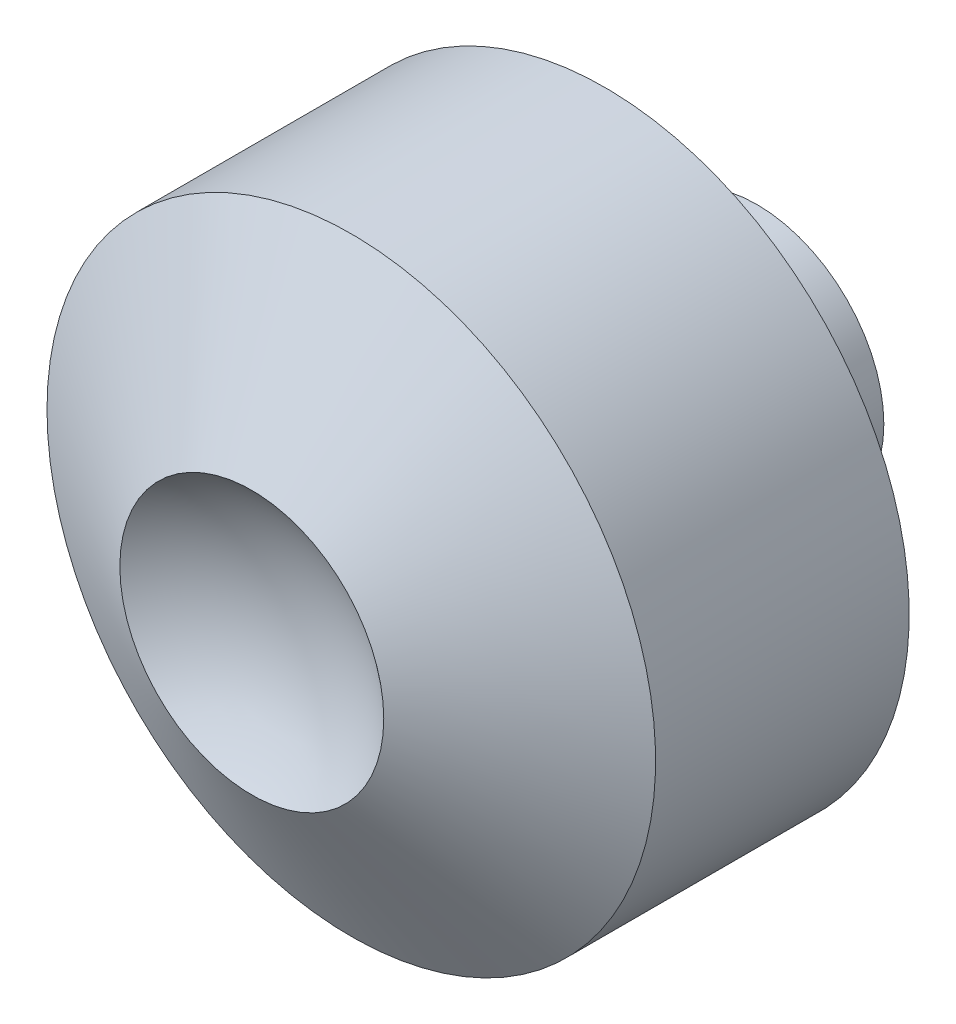
ISO-10303-21;
HEADER;
FILE_DESCRIPTION(('STEP AP214'),'2;1');
FILE_NAME('part.step','',(''),(''),'','','');
FILE_SCHEMA(('AUTOMOTIVE_DESIGN { 1 0 10303 214 1 1 1 1 }'));
ENDSEC;
DATA;
#1=APPLICATION_CONTEXT('core data for automotive mechanical design processes');
#2=APPLICATION_PROTOCOL_DEFINITION('international standard','automotive_design',2000,#1);
#3=PRODUCT_CONTEXT('',#1,'mechanical');
#4=PRODUCT('Part','Part','',(#3));
#5=PRODUCT_RELATED_PRODUCT_CATEGORY('part','',(#4));
#6=PRODUCT_DEFINITION_FORMATION('','',#4);
#7=PRODUCT_DEFINITION_CONTEXT('part definition',#1,'design');
#8=PRODUCT_DEFINITION('design','',#6,#7);
#9=PRODUCT_DEFINITION_SHAPE('','',#8);
#10=(LENGTH_UNIT() NAMED_UNIT(*) SI_UNIT(.MILLI.,.METRE.));
#11=(NAMED_UNIT(*) PLANE_ANGLE_UNIT() SI_UNIT($,.RADIAN.));
#12=(NAMED_UNIT(*) SI_UNIT($,.STERADIAN.) SOLID_ANGLE_UNIT());
#13=UNCERTAINTY_MEASURE_WITH_UNIT(LENGTH_MEASURE(1.E-05),#10,'distance_accuracy_value','');
#14=(GEOMETRIC_REPRESENTATION_CONTEXT(3) GLOBAL_UNCERTAINTY_ASSIGNED_CONTEXT((#13)) GLOBAL_UNIT_ASSIGNED_CONTEXT((#10,
#11,#12)) REPRESENTATION_CONTEXT('',''));
#15=CARTESIAN_POINT('',(0.,0.,0.));
#16=DIRECTION('',(0.,0.,1.));
#17=DIRECTION('',(1.,0.,0.));
#18=AXIS2_PLACEMENT_3D('',#15,#16,#17);
#19=CARTESIAN_POINT('',(0.,0.,5.));
#20=DIRECTION('',(0.,1.,0.));
#21=DIRECTION('',(0.,0.,-1.));
#22=AXIS2_PLACEMENT_3D('',#19,#20,#21);
#23=SPHERICAL_SURFACE('',#22,4.);
#24=CARTESIAN_POINT('',(0.,0.,5.));
#25=DIRECTION('',(0.,0.,-1.));
#26=DIRECTION('',(-1.,0.,0.));
#27=AXIS2_PLACEMENT_3D('',#24,#25,#26);
#28=SPHERICAL_SURFACE('',#27,4.);
#29=CARTESIAN_POINT('',(0.,0.,1.96189209298539));
#30=DIRECTION('',(0.,0.,-1.));
#31=DIRECTION('',(-1.,0.,0.));
#32=AXIS2_PLACEMENT_3D('',#29,#30,#31);
#33=CIRCLE('',#32,2.60190321598158);
#34=CARTESIAN_POINT('',(-2.60190321598158,0.,1.96189209298539));
#35=VERTEX_POINT('',#34);
#36=EDGE_CURVE('E50',#35,#35,#33,.F.);
#37=ORIENTED_EDGE('',*,*,#36,.T.);
#38=EDGE_LOOP('',(#37));
#39=FACE_BOUND('',#38,.T.);
#40=ADVANCED_FACE('F45',(#39),#28,.F.);
#41=CARTESIAN_POINT('',(0.,0.,2.));
#42=DIRECTION('',(0.,0.,-1.));
#43=DIRECTION('',(-1.,0.,0.));
#44=AXIS2_PLACEMENT_3D('',#41,#42,#43);
#45=CONICAL_SURFACE('',#44,2.53589838486217,1.0471975511966);
#46=CARTESIAN_POINT('',(0.,0.,0.));
#47=DIRECTION('',(0.,0.,-1.));
#48=DIRECTION('',(-1.,0.,0.));
#49=AXIS2_PLACEMENT_3D('',#46,#47,#48);
#50=CIRCLE('',#49,6.);
#51=CARTESIAN_POINT('',(-6.,0.,0.));
#52=VERTEX_POINT('',#51);
#53=EDGE_CURVE('E63',#52,#52,#50,.T.);
#54=ORIENTED_EDGE('',*,*,#53,.F.);
#55=EDGE_LOOP('',(#54));
#56=FACE_BOUND('',#55,.T.);
#57=ORIENTED_EDGE('',*,*,#36,.F.);
#58=EDGE_LOOP('',(#57));
#59=FACE_BOUND('',#58,.T.);
#60=ADVANCED_FACE('F48',(#56,#59),#45,.T.);
#61=CARTESIAN_POINT('',(0.,0.,-5.));
#62=DIRECTION('',(0.,0.,1.));
#63=DIRECTION('',(1.,0.,0.));
#64=AXIS2_PLACEMENT_3D('',#61,#62,#63);
#65=CYLINDRICAL_SURFACE('',#64,6.);
#66=CARTESIAN_POINT('',(0.,0.,-5.));
#67=DIRECTION('',(0.,0.,-1.));
#68=DIRECTION('',(-1.,0.,0.));
#69=AXIS2_PLACEMENT_3D('',#66,#67,#68);
#70=CIRCLE('',#69,6.);
#71=CARTESIAN_POINT('',(-6.,0.,-5.));
#72=VERTEX_POINT('',#71);
#73=EDGE_CURVE('E58',#72,#72,#70,.T.);
#74=ORIENTED_EDGE('',*,*,#73,.F.);
#75=EDGE_LOOP('',(#74));
#76=FACE_BOUND('',#75,.T.);
#77=ORIENTED_EDGE('',*,*,#53,.T.);
#78=EDGE_LOOP('',(#77));
#79=FACE_BOUND('',#78,.T.);
#80=ADVANCED_FACE('F81',(#76,#79),#65,.T.);
#81=CARTESIAN_POINT('',(0.,0.,-5.));
#82=DIRECTION('',(0.,0.,-1.));
#83=DIRECTION('',(-1.,0.,0.));
#84=AXIS2_PLACEMENT_3D('',#81,#82,#83);
#85=PLANE('',#84);
#86=CARTESIAN_POINT('',(0.,0.,-5.));
#87=DIRECTION('',(0.,0.,-1.));
#88=DIRECTION('',(-1.,0.,0.));
#89=AXIS2_PLACEMENT_3D('',#86,#87,#88);
#90=CIRCLE('',#89,2.5);
#91=CARTESIAN_POINT('',(-2.5,0.,-5.));
#92=VERTEX_POINT('',#91);
#93=EDGE_CURVE('E10',#92,#92,#90,.T.);
#94=ORIENTED_EDGE('',*,*,#93,.F.);
#95=EDGE_LOOP('',(#94));
#96=FACE_BOUND('',#95,.T.);
#97=ORIENTED_EDGE('',*,*,#73,.T.);
#98=EDGE_LOOP('',(#97));
#99=FACE_BOUND('',#98,.T.);
#100=ADVANCED_FACE('F74',(#96,#99),#85,.T.);
#101=CARTESIAN_POINT('',(0.,0.,-8.));
#102=DIRECTION('',(0.,0.,1.));
#103=DIRECTION('',(1.,0.,0.));
#104=AXIS2_PLACEMENT_3D('',#101,#102,#103);
#105=CYLINDRICAL_SURFACE('',#104,2.5);
#106=CARTESIAN_POINT('',(0.,0.,-8.));
#107=DIRECTION('',(0.,0.,-1.));
#108=DIRECTION('',(-1.,0.,0.));
#109=AXIS2_PLACEMENT_3D('',#106,#107,#108);
#110=CIRCLE('',#109,2.5);
#111=CARTESIAN_POINT('',(-2.5,0.,-8.));
#112=VERTEX_POINT('',#111);
#113=EDGE_CURVE('E61',#112,#112,#110,.T.);
#114=ORIENTED_EDGE('',*,*,#113,.F.);
#115=EDGE_LOOP('',(#114));
#116=FACE_BOUND('',#115,.T.);
#117=ORIENTED_EDGE('',*,*,#93,.T.);
#118=EDGE_LOOP('',(#117));
#119=FACE_BOUND('',#118,.T.);
#120=ADVANCED_FACE('F72',(#116,#119),#105,.T.);
#121=CARTESIAN_POINT('',(0.,0.,-8.));
#122=DIRECTION('',(0.,0.,-1.));
#123=DIRECTION('',(-1.,0.,0.));
#124=AXIS2_PLACEMENT_3D('',#121,#122,#123);
#125=PLANE('',#124);
#126=ORIENTED_EDGE('',*,*,#113,.T.);
#127=EDGE_LOOP('',(#126));
#128=FACE_BOUND('',#127,.T.);
#129=ADVANCED_FACE('F70',(#128),#125,.T.);
#130=CLOSED_SHELL('',(#40,#60,#80,#100,#120,#129));
#131=MANIFOLD_SOLID_BREP('B2',#130);
#132=ADVANCED_BREP_SHAPE_REPRESENTATION('',(#18,#131),#14);
#133=SHAPE_DEFINITION_REPRESENTATION(#9,#132);
ENDSEC;
END-ISO-10303-21;
